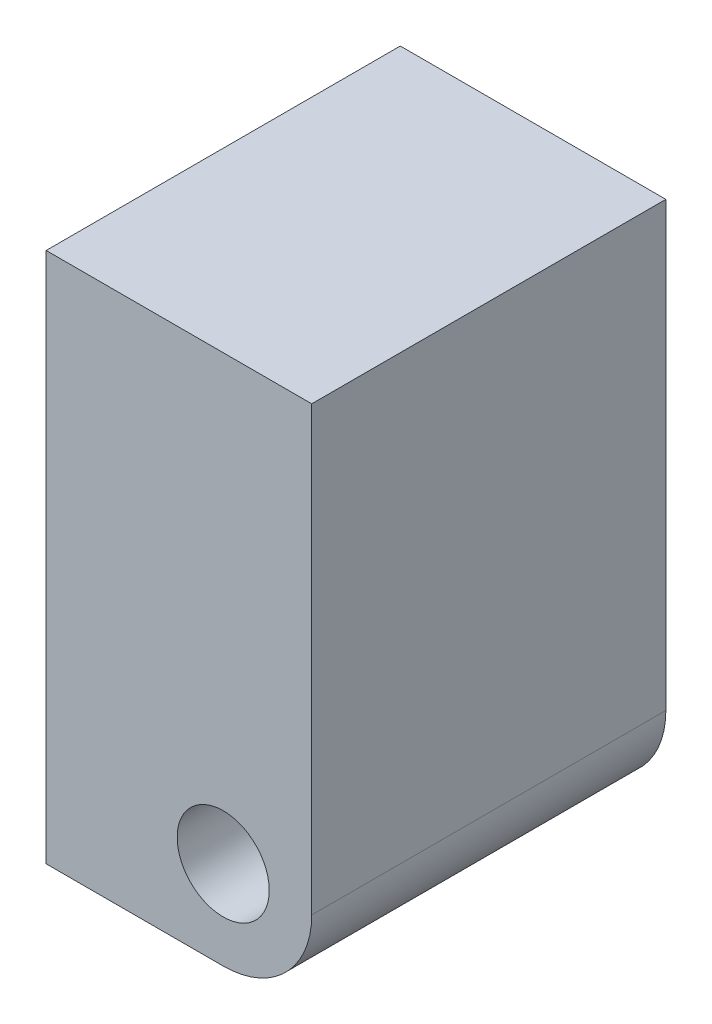
ISO-10303-21;
HEADER;
FILE_DESCRIPTION(('STEP AP214'),'2;1');
FILE_NAME('part.step','',(''),(''),'','','');
FILE_SCHEMA(('AUTOMOTIVE_DESIGN { 1 0 10303 214 1 1 1 1 }'));
ENDSEC;
DATA;
#1=APPLICATION_CONTEXT('core data for automotive mechanical design processes');
#2=APPLICATION_PROTOCOL_DEFINITION('international standard','automotive_design',2000,#1);
#3=PRODUCT_CONTEXT('',#1,'mechanical');
#4=PRODUCT('Part','Part','',(#3));
#5=PRODUCT_RELATED_PRODUCT_CATEGORY('part','',(#4));
#6=PRODUCT_DEFINITION_FORMATION('','',#4);
#7=PRODUCT_DEFINITION_CONTEXT('part definition',#1,'design');
#8=PRODUCT_DEFINITION('design','',#6,#7);
#9=PRODUCT_DEFINITION_SHAPE('','',#8);
#10=(LENGTH_UNIT() NAMED_UNIT(*) SI_UNIT(.MILLI.,.METRE.));
#11=(NAMED_UNIT(*) PLANE_ANGLE_UNIT() SI_UNIT($,.RADIAN.));
#12=(NAMED_UNIT(*) SI_UNIT($,.STERADIAN.) SOLID_ANGLE_UNIT());
#13=UNCERTAINTY_MEASURE_WITH_UNIT(LENGTH_MEASURE(1.E-05),#10,'distance_accuracy_value','');
#14=(GEOMETRIC_REPRESENTATION_CONTEXT(3) GLOBAL_UNCERTAINTY_ASSIGNED_CONTEXT((#13)) GLOBAL_UNIT_ASSIGNED_CONTEXT((#10,
#11,#12)) REPRESENTATION_CONTEXT('',''));
#15=CARTESIAN_POINT('',(0.,0.,0.));
#16=DIRECTION('',(0.,0.,1.));
#17=DIRECTION('',(1.,0.,0.));
#18=AXIS2_PLACEMENT_3D('',#15,#16,#17);
#19=CARTESIAN_POINT('',(0.,0.,20.));
#20=DIRECTION('',(0.,0.,1.));
#21=DIRECTION('',(1.,0.,0.));
#22=AXIS2_PLACEMENT_3D('',#19,#20,#21);
#23=PLANE('',#22);
#24=DIRECTION('',(-1.,0.,0.));
#25=VECTOR('',#24,1.);
#26=CARTESIAN_POINT('',(-10.,25.,20.));
#27=LINE('',#26,#25);
#28=CARTESIAN_POINT('',(5.00000000000001,25.,20.));
#29=VERTEX_POINT('',#28);
#30=CARTESIAN_POINT('',(-10.,25.,20.));
#31=VERTEX_POINT('',#30);
#32=EDGE_CURVE('E50',#29,#31,#27,.T.);
#33=ORIENTED_EDGE('',*,*,#32,.T.);
#34=DIRECTION('',(0.,-1.,0.));
#35=VECTOR('',#34,1.);
#36=CARTESIAN_POINT('',(-10.,-5.,20.));
#37=LINE('',#36,#35);
#38=CARTESIAN_POINT('',(-10.,-5.,20.));
#39=VERTEX_POINT('',#38);
#40=EDGE_CURVE('E85',#31,#39,#37,.T.);
#41=ORIENTED_EDGE('',*,*,#40,.T.);
#42=DIRECTION('',(1.,0.,0.));
#43=VECTOR('',#42,1.);
#44=CARTESIAN_POINT('',(0.,-5.,20.));
#45=LINE('',#44,#43);
#46=CARTESIAN_POINT('',(0.,-5.,20.));
#47=VERTEX_POINT('',#46);
#48=EDGE_CURVE('E90',#39,#47,#45,.T.);
#49=ORIENTED_EDGE('',*,*,#48,.T.);
#50=CARTESIAN_POINT('',(0.,0.,20.));
#51=DIRECTION('',(0.,0.,1.));
#52=DIRECTION('',(1.,0.,0.));
#53=AXIS2_PLACEMENT_3D('',#50,#51,#52);
#54=CIRCLE('',#53,5.);
#55=CARTESIAN_POINT('',(5.,0.,20.));
#56=VERTEX_POINT('',#55);
#57=EDGE_CURVE('E94',#47,#56,#54,.T.);
#58=ORIENTED_EDGE('',*,*,#57,.T.);
#59=DIRECTION('',(0.,1.,0.));
#60=VECTOR('',#59,1.);
#61=CARTESIAN_POINT('',(5.,0.,20.));
#62=LINE('',#61,#60);
#63=EDGE_CURVE('E106',#56,#29,#62,.T.);
#64=ORIENTED_EDGE('',*,*,#63,.T.);
#65=EDGE_LOOP('',(#33,#41,#49,#58,#64));
#66=FACE_BOUND('',#65,.T.);
#67=CARTESIAN_POINT('',(0.,0.,20.));
#68=DIRECTION('',(0.,0.,1.));
#69=DIRECTION('',(1.,0.,0.));
#70=AXIS2_PLACEMENT_3D('',#67,#68,#69);
#71=CIRCLE('',#70,2.6);
#72=CARTESIAN_POINT('',(2.6,0.,20.));
#73=VERTEX_POINT('',#72);
#74=EDGE_CURVE('E114',#73,#73,#71,.T.);
#75=ORIENTED_EDGE('',*,*,#74,.F.);
#76=EDGE_LOOP('',(#75));
#77=FACE_BOUND('',#76,.T.);
#78=ADVANCED_FACE('F33',(#66,#77),#23,.T.);
#79=CARTESIAN_POINT('',(0.,0.,0.));
#80=DIRECTION('',(0.,0.,1.));
#81=DIRECTION('',(1.,0.,0.));
#82=AXIS2_PLACEMENT_3D('',#79,#80,#81);
#83=PLANE('',#82);
#84=DIRECTION('',(0.,-1.,0.));
#85=VECTOR('',#84,1.);
#86=CARTESIAN_POINT('',(-10.,-5.,0.));
#87=LINE('',#86,#85);
#88=CARTESIAN_POINT('',(-10.,25.,0.));
#89=VERTEX_POINT('',#88);
#90=CARTESIAN_POINT('',(-10.,-5.,0.));
#91=VERTEX_POINT('',#90);
#92=EDGE_CURVE('E112',#89,#91,#87,.T.);
#93=ORIENTED_EDGE('',*,*,#92,.F.);
#94=DIRECTION('',(-1.,0.,0.));
#95=VECTOR('',#94,1.);
#96=CARTESIAN_POINT('',(0.,25.,0.));
#97=LINE('',#96,#95);
#98=CARTESIAN_POINT('',(5.00000000000001,25.,0.));
#99=VERTEX_POINT('',#98);
#100=EDGE_CURVE('E118',#99,#89,#97,.T.);
#101=ORIENTED_EDGE('',*,*,#100,.F.);
#102=DIRECTION('',(0.,1.,0.));
#103=VECTOR('',#102,1.);
#104=CARTESIAN_POINT('',(5.,0.,0.));
#105=LINE('',#104,#103);
#106=CARTESIAN_POINT('',(5.,0.,0.));
#107=VERTEX_POINT('',#106);
#108=EDGE_CURVE('E78',#107,#99,#105,.T.);
#109=ORIENTED_EDGE('',*,*,#108,.F.);
#110=CARTESIAN_POINT('',(0.,0.,0.));
#111=DIRECTION('',(0.,0.,1.));
#112=DIRECTION('',(1.,0.,0.));
#113=AXIS2_PLACEMENT_3D('',#110,#111,#112);
#114=CIRCLE('',#113,5.);
#115=CARTESIAN_POINT('',(0.,-5.,0.));
#116=VERTEX_POINT('',#115);
#117=EDGE_CURVE('E71',#116,#107,#114,.T.);
#118=ORIENTED_EDGE('',*,*,#117,.F.);
#119=DIRECTION('',(1.,0.,0.));
#120=VECTOR('',#119,1.);
#121=CARTESIAN_POINT('',(0.,-5.,0.));
#122=LINE('',#121,#120);
#123=EDGE_CURVE('E101',#91,#116,#122,.T.);
#124=ORIENTED_EDGE('',*,*,#123,.F.);
#125=EDGE_LOOP('',(#93,#101,#109,#118,#124));
#126=FACE_BOUND('',#125,.T.);
#127=CARTESIAN_POINT('',(0.,0.,0.));
#128=DIRECTION('',(0.,0.,1.));
#129=DIRECTION('',(1.,0.,0.));
#130=AXIS2_PLACEMENT_3D('',#127,#128,#129);
#131=CIRCLE('',#130,2.6);
#132=CARTESIAN_POINT('',(2.6,0.,0.));
#133=VERTEX_POINT('',#132);
#134=EDGE_CURVE('E130',#133,#133,#131,.T.);
#135=ORIENTED_EDGE('',*,*,#134,.T.);
#136=EDGE_LOOP('',(#135));
#137=FACE_BOUND('',#136,.T.);
#138=ADVANCED_FACE('F123',(#126,#137),#83,.F.);
#139=CARTESIAN_POINT('',(-10.,-5.,20.));
#140=DIRECTION('',(1.,0.,0.));
#141=DIRECTION('',(0.,0.,-1.));
#142=AXIS2_PLACEMENT_3D('',#139,#140,#141);
#143=PLANE('',#142);
#144=ORIENTED_EDGE('',*,*,#92,.T.);
#145=DIRECTION('',(0.,0.,-1.));
#146=VECTOR('',#145,1.);
#147=CARTESIAN_POINT('',(-10.,-5.,20.));
#148=LINE('',#147,#146);
#149=EDGE_CURVE('E42',#39,#91,#148,.T.);
#150=ORIENTED_EDGE('',*,*,#149,.F.);
#151=ORIENTED_EDGE('',*,*,#40,.F.);
#152=DIRECTION('',(0.,0.,-1.));
#153=VECTOR('',#152,1.);
#154=CARTESIAN_POINT('',(-10.,25.,20.));
#155=LINE('',#154,#153);
#156=EDGE_CURVE('E11',#31,#89,#155,.T.);
#157=ORIENTED_EDGE('',*,*,#156,.T.);
#158=EDGE_LOOP('',(#144,#150,#151,#157));
#159=FACE_BOUND('',#158,.T.);
#160=ADVANCED_FACE('F35',(#159),#143,.F.);
#161=CARTESIAN_POINT('',(0.,-5.,20.));
#162=DIRECTION('',(0.,1.,0.));
#163=DIRECTION('',(-1.,0.,0.));
#164=AXIS2_PLACEMENT_3D('',#161,#162,#163);
#165=PLANE('',#164);
#166=ORIENTED_EDGE('',*,*,#123,.T.);
#167=DIRECTION('',(0.,0.,-1.));
#168=VECTOR('',#167,1.);
#169=CARTESIAN_POINT('',(0.,-5.,20.));
#170=LINE('',#169,#168);
#171=EDGE_CURVE('E98',#47,#116,#170,.T.);
#172=ORIENTED_EDGE('',*,*,#171,.F.);
#173=ORIENTED_EDGE('',*,*,#48,.F.);
#174=ORIENTED_EDGE('',*,*,#149,.T.);
#175=EDGE_LOOP('',(#166,#172,#173,#174));
#176=FACE_BOUND('',#175,.T.);
#177=ADVANCED_FACE('F99',(#176),#165,.F.);
#178=CARTESIAN_POINT('',(0.,0.,20.));
#179=DIRECTION('',(0.,0.,-1.));
#180=DIRECTION('',(-1.,0.,0.));
#181=AXIS2_PLACEMENT_3D('',#178,#179,#180);
#182=CYLINDRICAL_SURFACE('',#181,5.);
#183=ORIENTED_EDGE('',*,*,#117,.T.);
#184=DIRECTION('',(0.,0.,-1.));
#185=VECTOR('',#184,1.);
#186=CARTESIAN_POINT('',(5.,0.,20.));
#187=LINE('',#186,#185);
#188=EDGE_CURVE('E102',#56,#107,#187,.T.);
#189=ORIENTED_EDGE('',*,*,#188,.F.);
#190=ORIENTED_EDGE('',*,*,#57,.F.);
#191=ORIENTED_EDGE('',*,*,#171,.T.);
#192=EDGE_LOOP('',(#183,#189,#190,#191));
#193=FACE_BOUND('',#192,.T.);
#194=ADVANCED_FACE('F104',(#193),#182,.T.);
#195=CARTESIAN_POINT('',(5.,0.,20.));
#196=DIRECTION('',(-1.,0.,0.));
#197=DIRECTION('',(0.,-1.,0.));
#198=AXIS2_PLACEMENT_3D('',#195,#196,#197);
#199=PLANE('',#198);
#200=ORIENTED_EDGE('',*,*,#108,.T.);
#201=DIRECTION('',(0.,0.,-1.));
#202=VECTOR('',#201,1.);
#203=CARTESIAN_POINT('',(5.00000000000001,25.,20.));
#204=LINE('',#203,#202);
#205=EDGE_CURVE('E108',#29,#99,#204,.T.);
#206=ORIENTED_EDGE('',*,*,#205,.F.);
#207=ORIENTED_EDGE('',*,*,#63,.F.);
#208=ORIENTED_EDGE('',*,*,#188,.T.);
#209=EDGE_LOOP('',(#200,#206,#207,#208));
#210=FACE_BOUND('',#209,.T.);
#211=ADVANCED_FACE('F127',(#210),#199,.F.);
#212=CARTESIAN_POINT('',(0.,25.,20.));
#213=DIRECTION('',(0.,-1.,0.));
#214=DIRECTION('',(0.,0.,-1.));
#215=AXIS2_PLACEMENT_3D('',#212,#213,#214);
#216=PLANE('',#215);
#217=ORIENTED_EDGE('',*,*,#100,.T.);
#218=ORIENTED_EDGE('',*,*,#156,.F.);
#219=ORIENTED_EDGE('',*,*,#32,.F.);
#220=ORIENTED_EDGE('',*,*,#205,.T.);
#221=EDGE_LOOP('',(#217,#218,#219,#220));
#222=FACE_BOUND('',#221,.T.);
#223=ADVANCED_FACE('F126',(#222),#216,.F.);
#224=CARTESIAN_POINT('',(0.,0.,20.));
#225=DIRECTION('',(0.,0.,-1.));
#226=DIRECTION('',(-1.,0.,0.));
#227=AXIS2_PLACEMENT_3D('',#224,#225,#226);
#228=CYLINDRICAL_SURFACE('',#227,2.6);
#229=ORIENTED_EDGE('',*,*,#74,.T.);
#230=EDGE_LOOP('',(#229));
#231=FACE_BOUND('',#230,.T.);
#232=ORIENTED_EDGE('',*,*,#134,.F.);
#233=EDGE_LOOP('',(#232));
#234=FACE_BOUND('',#233,.T.);
#235=ADVANCED_FACE('F136',(#231,#234),#228,.F.);
#236=CLOSED_SHELL('',(#78,#138,#160,#177,#194,#211,#223,#235));
#237=MANIFOLD_SOLID_BREP('B2',#236);
#238=ADVANCED_BREP_SHAPE_REPRESENTATION('',(#18,#237),#14);
#239=SHAPE_DEFINITION_REPRESENTATION(#9,#238);
ENDSEC;
END-ISO-10303-21;
